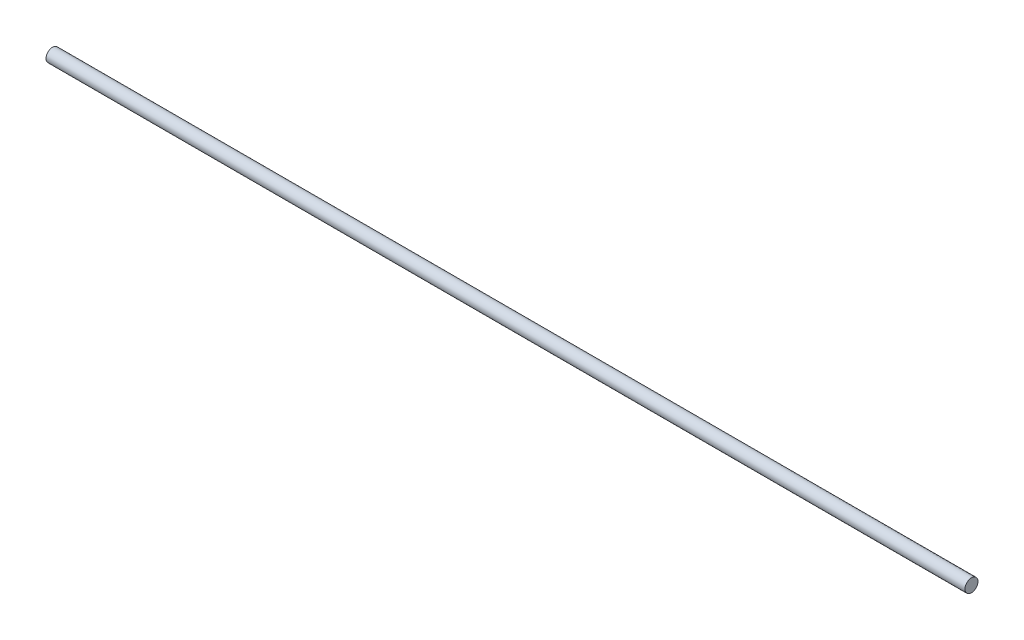
ISO-10303-21;
HEADER;
FILE_DESCRIPTION(('STEP AP214'),'2;1');
FILE_NAME('part.step','',(''),(''),'','','');
FILE_SCHEMA(('AUTOMOTIVE_DESIGN { 1 0 10303 214 1 1 1 1 }'));
ENDSEC;
DATA;
#1=APPLICATION_CONTEXT('core data for automotive mechanical design processes');
#2=APPLICATION_PROTOCOL_DEFINITION('international standard','automotive_design',2000,#1);
#3=PRODUCT_CONTEXT('',#1,'mechanical');
#4=PRODUCT('Part','Part','',(#3));
#5=PRODUCT_RELATED_PRODUCT_CATEGORY('part','',(#4));
#6=PRODUCT_DEFINITION_FORMATION('','',#4);
#7=PRODUCT_DEFINITION_CONTEXT('part definition',#1,'design');
#8=PRODUCT_DEFINITION('design','',#6,#7);
#9=PRODUCT_DEFINITION_SHAPE('','',#8);
#10=(LENGTH_UNIT() NAMED_UNIT(*) SI_UNIT(.MILLI.,.METRE.));
#11=(NAMED_UNIT(*) PLANE_ANGLE_UNIT() SI_UNIT($,.RADIAN.));
#12=(NAMED_UNIT(*) SI_UNIT($,.STERADIAN.) SOLID_ANGLE_UNIT());
#13=UNCERTAINTY_MEASURE_WITH_UNIT(LENGTH_MEASURE(1.E-05),#10,'distance_accuracy_value','');
#14=(GEOMETRIC_REPRESENTATION_CONTEXT(3) GLOBAL_UNCERTAINTY_ASSIGNED_CONTEXT((#13)) GLOBAL_UNIT_ASSIGNED_CONTEXT((#10,
#11,#12)) REPRESENTATION_CONTEXT('',''));
#15=CARTESIAN_POINT('',(0.,0.,0.));
#16=DIRECTION('',(0.,0.,1.));
#17=DIRECTION('',(1.,0.,0.));
#18=AXIS2_PLACEMENT_3D('',#15,#16,#17);
#19=CARTESIAN_POINT('',(-176.,331.578947368272,-33.4999999991794));
#20=DIRECTION('',(1.,0.,0.));
#21=DIRECTION('',(0.,0.,-1.));
#22=AXIS2_PLACEMENT_3D('',#19,#20,#21);
#23=CYLINDRICAL_SURFACE('',#22,2.5);
#24=CARTESIAN_POINT('',(-176.,331.578947368272,-33.4999999991794));
#25=DIRECTION('',(1.,0.,0.));
#26=DIRECTION('',(0.,0.,-1.));
#27=AXIS2_PLACEMENT_3D('',#24,#25,#26);
#28=CIRCLE('',#27,2.5);
#29=CARTESIAN_POINT('',(-176.,331.578947368272,-35.9999999991794));
#30=VERTEX_POINT('',#29);
#31=EDGE_CURVE('E10',#30,#30,#28,.T.);
#32=ORIENTED_EDGE('',*,*,#31,.T.);
#33=EDGE_LOOP('',(#32));
#34=FACE_BOUND('',#33,.T.);
#35=CARTESIAN_POINT('',(176.,331.578947368272,-33.4999999991794));
#36=DIRECTION('',(1.,0.,0.));
#37=DIRECTION('',(0.,0.,-1.));
#38=AXIS2_PLACEMENT_3D('',#35,#36,#37);
#39=CIRCLE('',#38,2.5);
#40=CARTESIAN_POINT('',(176.,331.578947368272,-35.9999999991794));
#41=VERTEX_POINT('',#40);
#42=EDGE_CURVE('E36',#41,#41,#39,.T.);
#43=ORIENTED_EDGE('',*,*,#42,.F.);
#44=EDGE_LOOP('',(#43));
#45=FACE_BOUND('',#44,.T.);
#46=ADVANCED_FACE('F30',(#34,#45),#23,.T.);
#47=CARTESIAN_POINT('',(-176.,334.078947368272,-33.4999999991794));
#48=DIRECTION('',(-1.,0.,0.));
#49=DIRECTION('',(0.,0.,1.));
#50=AXIS2_PLACEMENT_3D('',#47,#48,#49);
#51=PLANE('',#50);
#52=ORIENTED_EDGE('',*,*,#31,.F.);
#53=EDGE_LOOP('',(#52));
#54=FACE_BOUND('',#53,.T.);
#55=ADVANCED_FACE('F45',(#54),#51,.T.);
#56=CARTESIAN_POINT('',(176.,331.578947368272,-33.4999999991794));
#57=DIRECTION('',(1.,0.,0.));
#58=DIRECTION('',(0.,0.,-1.));
#59=AXIS2_PLACEMENT_3D('',#56,#57,#58);
#60=PLANE('',#59);
#61=ORIENTED_EDGE('',*,*,#42,.T.);
#62=EDGE_LOOP('',(#61));
#63=FACE_BOUND('',#62,.T.);
#64=ADVANCED_FACE('F42',(#63),#60,.T.);
#65=CLOSED_SHELL('',(#46,#55,#64));
#66=MANIFOLD_SOLID_BREP('B2',#65);
#67=ADVANCED_BREP_SHAPE_REPRESENTATION('',(#18,#66),#14);
#68=SHAPE_DEFINITION_REPRESENTATION(#9,#67);
ENDSEC;
END-ISO-10303-21;
